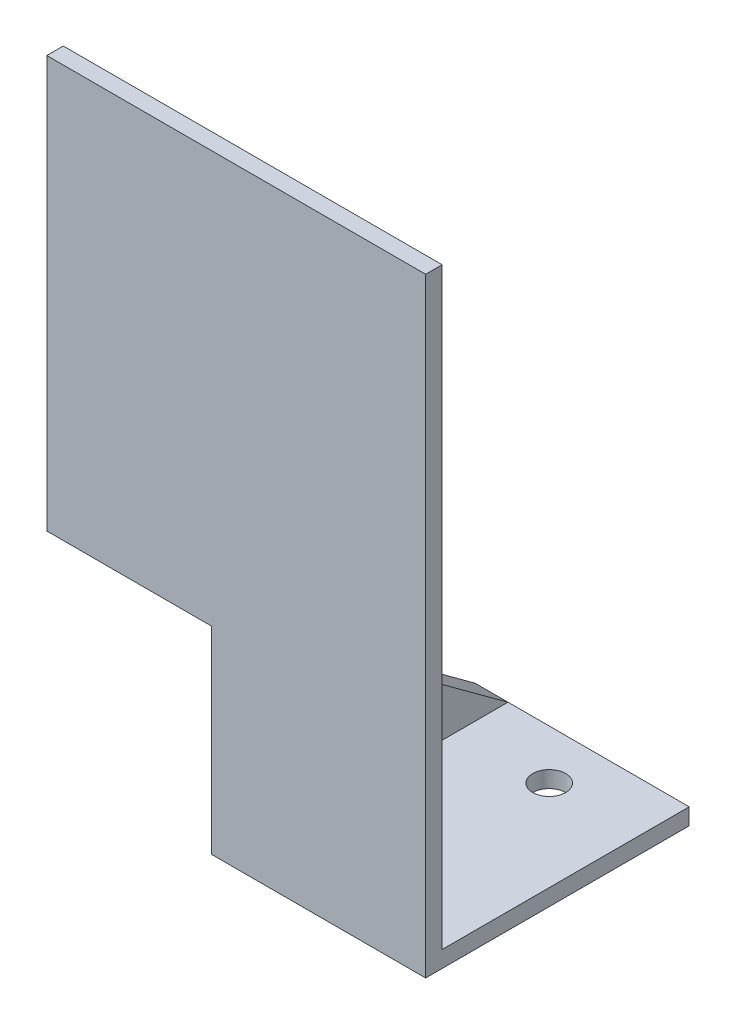
ISO-10303-21;
HEADER;
FILE_DESCRIPTION(('STEP AP214'),'2;1');
FILE_NAME('part.step','',(''),(''),'','','');
FILE_SCHEMA(('AUTOMOTIVE_DESIGN { 1 0 10303 214 1 1 1 1 }'));
ENDSEC;
DATA;
#1=APPLICATION_CONTEXT('core data for automotive mechanical design processes');
#2=APPLICATION_PROTOCOL_DEFINITION('international standard','automotive_design',2000,#1);
#3=PRODUCT_CONTEXT('',#1,'mechanical');
#4=PRODUCT('Part','Part','',(#3));
#5=PRODUCT_RELATED_PRODUCT_CATEGORY('part','',(#4));
#6=PRODUCT_DEFINITION_FORMATION('','',#4);
#7=PRODUCT_DEFINITION_CONTEXT('part definition',#1,'design');
#8=PRODUCT_DEFINITION('design','',#6,#7);
#9=PRODUCT_DEFINITION_SHAPE('','',#8);
#10=(LENGTH_UNIT() NAMED_UNIT(*) SI_UNIT(.MILLI.,.METRE.));
#11=(NAMED_UNIT(*) PLANE_ANGLE_UNIT() SI_UNIT($,.RADIAN.));
#12=(NAMED_UNIT(*) SI_UNIT($,.STERADIAN.) SOLID_ANGLE_UNIT());
#13=UNCERTAINTY_MEASURE_WITH_UNIT(LENGTH_MEASURE(1.E-05),#10,'distance_accuracy_value','');
#14=(GEOMETRIC_REPRESENTATION_CONTEXT(3) GLOBAL_UNCERTAINTY_ASSIGNED_CONTEXT((#13)) GLOBAL_UNIT_ASSIGNED_CONTEXT((#10,
#11,#12)) REPRESENTATION_CONTEXT('',''));
#15=CARTESIAN_POINT('',(0.,0.,0.));
#16=DIRECTION('',(0.,0.,1.));
#17=DIRECTION('',(1.,0.,0.));
#18=AXIS2_PLACEMENT_3D('',#15,#16,#17);
#19=CARTESIAN_POINT('',(146.05,6.35,0.));
#20=DIRECTION('',(0.,-1.,0.));
#21=DIRECTION('',(0.,0.,-1.));
#22=AXIS2_PLACEMENT_3D('',#19,#20,#21);
#23=PLANE('',#22);
#24=CARTESIAN_POINT('',(111.125,6.35,19.05));
#25=DIRECTION('',(0.,1.,0.));
#26=DIRECTION('',(0.,0.,1.));
#27=AXIS2_PLACEMENT_3D('',#24,#25,#26);
#28=CIRCLE('',#27,6.35);
#29=CARTESIAN_POINT('',(111.125,6.35,25.4));
#30=VERTEX_POINT('',#29);
#31=EDGE_CURVE('E218',#30,#30,#28,.T.);
#32=ORIENTED_EDGE('',*,*,#31,.F.);
#33=EDGE_LOOP('',(#32));
#34=FACE_BOUND('',#33,.T.);
#35=CARTESIAN_POINT('',(111.125,6.34999999999999,82.55));
#36=DIRECTION('',(0.,1.,0.));
#37=DIRECTION('',(0.,0.,1.));
#38=AXIS2_PLACEMENT_3D('',#35,#36,#37);
#39=CIRCLE('',#38,6.34999999999999);
#40=CARTESIAN_POINT('',(111.125,6.34999999999999,88.9));
#41=VERTEX_POINT('',#40);
#42=EDGE_CURVE('E223',#41,#41,#39,.T.);
#43=ORIENTED_EDGE('',*,*,#42,.F.);
#44=EDGE_LOOP('',(#43));
#45=FACE_BOUND('',#44,.T.);
#46=DIRECTION('',(0.,0.,1.));
#47=VECTOR('',#46,1.);
#48=CARTESIAN_POINT('',(76.2,6.35,0.));
#49=LINE('',#48,#47);
#50=CARTESIAN_POINT('',(76.2,6.35,0.));
#51=VERTEX_POINT('',#50);
#52=CARTESIAN_POINT('',(76.2,6.34999999999999,95.25));
#53=VERTEX_POINT('',#52);
#54=EDGE_CURVE('E145',#51,#53,#49,.T.);
#55=ORIENTED_EDGE('',*,*,#54,.T.);
#56=DIRECTION('',(-1.,0.,0.));
#57=VECTOR('',#56,1.);
#58=CARTESIAN_POINT('',(146.05,6.34999999999999,95.25));
#59=LINE('',#58,#57);
#60=CARTESIAN_POINT('',(146.05,6.34999999999999,95.25));
#61=VERTEX_POINT('',#60);
#62=EDGE_CURVE('E212',#61,#53,#59,.T.);
#63=ORIENTED_EDGE('',*,*,#62,.F.);
#64=DIRECTION('',(0.,0.,1.));
#65=VECTOR('',#64,1.);
#66=CARTESIAN_POINT('',(146.05,6.35,0.));
#67=LINE('',#66,#65);
#68=CARTESIAN_POINT('',(146.05,6.35,0.));
#69=VERTEX_POINT('',#68);
#70=EDGE_CURVE('E171',#69,#61,#67,.T.);
#71=ORIENTED_EDGE('',*,*,#70,.F.);
#72=DIRECTION('',(-1.,0.,0.));
#73=VECTOR('',#72,1.);
#74=CARTESIAN_POINT('',(146.05,6.35,0.));
#75=LINE('',#74,#73);
#76=EDGE_CURVE('E49',#69,#51,#75,.T.);
#77=ORIENTED_EDGE('',*,*,#76,.T.);
#78=EDGE_LOOP('',(#55,#63,#71,#77));
#79=FACE_BOUND('',#78,.T.);
#80=ADVANCED_FACE('F39',(#34,#45,#79),#23,.F.);
#81=CARTESIAN_POINT('',(146.05,0.,0.));
#82=DIRECTION('',(0.,0.,1.));
#83=DIRECTION('',(1.,0.,0.));
#84=AXIS2_PLACEMENT_3D('',#81,#82,#83);
#85=PLANE('',#84);
#86=DIRECTION('',(-1.,0.,0.));
#87=VECTOR('',#86,1.);
#88=CARTESIAN_POINT('',(146.05,0.,0.));
#89=LINE('',#88,#87);
#90=CARTESIAN_POINT('',(146.05,0.,0.));
#91=VERTEX_POINT('',#90);
#92=CARTESIAN_POINT('',(63.5,0.,0.));
#93=VERTEX_POINT('',#92);
#94=EDGE_CURVE('E187',#91,#93,#89,.T.);
#95=ORIENTED_EDGE('',*,*,#94,.T.);
#96=DIRECTION('',(0.,1.,0.));
#97=VECTOR('',#96,1.);
#98=CARTESIAN_POINT('',(63.5,0.,0.));
#99=LINE('',#98,#97);
#100=CARTESIAN_POINT('',(63.5,6.35,0.));
#101=VERTEX_POINT('',#100);
#102=EDGE_CURVE('E133',#93,#101,#99,.T.);
#103=ORIENTED_EDGE('',*,*,#102,.T.);
#104=DIRECTION('',(-1.,0.,0.));
#105=VECTOR('',#104,1.);
#106=CARTESIAN_POINT('',(76.2,6.35,0.));
#107=LINE('',#106,#105);
#108=EDGE_CURVE('E57',#51,#101,#107,.T.);
#109=ORIENTED_EDGE('',*,*,#108,.F.);
#110=ORIENTED_EDGE('',*,*,#76,.F.);
#111=DIRECTION('',(0.,1.,0.));
#112=VECTOR('',#111,1.);
#113=CARTESIAN_POINT('',(146.05,0.,0.));
#114=LINE('',#113,#112);
#115=EDGE_CURVE('E167',#91,#69,#114,.T.);
#116=ORIENTED_EDGE('',*,*,#115,.F.);
#117=EDGE_LOOP('',(#95,#103,#109,#110,#116));
#118=FACE_BOUND('',#117,.T.);
#119=ADVANCED_FACE('F41',(#118),#85,.F.);
#120=CARTESIAN_POINT('',(146.05,6.34999999999999,95.25));
#121=DIRECTION('',(0.,0.,1.));
#122=DIRECTION('',(1.,0.,0.));
#123=AXIS2_PLACEMENT_3D('',#120,#121,#122);
#124=PLANE('',#123);
#125=DIRECTION('',(0.,1.,0.));
#126=VECTOR('',#125,1.);
#127=CARTESIAN_POINT('',(76.2,6.34999999999999,95.25));
#128=LINE('',#127,#126);
#129=CARTESIAN_POINT('',(76.2,76.2,95.25));
#130=VERTEX_POINT('',#129);
#131=EDGE_CURVE('E65',#53,#130,#128,.T.);
#132=ORIENTED_EDGE('',*,*,#131,.T.);
#133=DIRECTION('',(-1.,0.,0.));
#134=VECTOR('',#133,1.);
#135=CARTESIAN_POINT('',(76.2,76.2,95.25));
#136=LINE('',#135,#134);
#137=CARTESIAN_POINT('',(63.5,76.2,95.25));
#138=VERTEX_POINT('',#137);
#139=EDGE_CURVE('E135',#130,#138,#136,.T.);
#140=ORIENTED_EDGE('',*,*,#139,.T.);
#141=DIRECTION('',(-1.,0.,0.));
#142=VECTOR('',#141,1.);
#143=CARTESIAN_POINT('',(146.05,76.2,95.25));
#144=LINE('',#143,#142);
#145=CARTESIAN_POINT('',(0.,76.2,95.25));
#146=VERTEX_POINT('',#145);
#147=EDGE_CURVE('E126',#138,#146,#144,.T.);
#148=ORIENTED_EDGE('',*,*,#147,.T.);
#149=DIRECTION('',(0.,1.,0.));
#150=VECTOR('',#149,1.);
#151=CARTESIAN_POINT('',(0.,6.34999999999999,95.25));
#152=LINE('',#151,#150);
#153=CARTESIAN_POINT('',(0.,234.95,95.25));
#154=VERTEX_POINT('',#153);
#155=EDGE_CURVE('E166',#146,#154,#152,.T.);
#156=ORIENTED_EDGE('',*,*,#155,.T.);
#157=DIRECTION('',(-1.,0.,0.));
#158=VECTOR('',#157,1.);
#159=CARTESIAN_POINT('',(146.05,234.95,95.25));
#160=LINE('',#159,#158);
#161=CARTESIAN_POINT('',(146.05,234.95,95.25));
#162=VERTEX_POINT('',#161);
#163=EDGE_CURVE('E208',#162,#154,#160,.T.);
#164=ORIENTED_EDGE('',*,*,#163,.F.);
#165=DIRECTION('',(0.,1.,0.));
#166=VECTOR('',#165,1.);
#167=CARTESIAN_POINT('',(146.05,6.34999999999999,95.25));
#168=LINE('',#167,#166);
#169=EDGE_CURVE('E175',#61,#162,#168,.T.);
#170=ORIENTED_EDGE('',*,*,#169,.F.);
#171=ORIENTED_EDGE('',*,*,#62,.T.);
#172=EDGE_LOOP('',(#132,#140,#148,#156,#164,#170,#171));
#173=FACE_BOUND('',#172,.T.);
#174=ADVANCED_FACE('F136',(#173),#124,.F.);
#175=CARTESIAN_POINT('',(146.05,234.95,101.6));
#176=DIRECTION('',(0.,-1.,0.));
#177=DIRECTION('',(0.,0.,-1.));
#178=AXIS2_PLACEMENT_3D('',#175,#176,#177);
#179=PLANE('',#178);
#180=DIRECTION('',(0.,0.,1.));
#181=VECTOR('',#180,1.);
#182=CARTESIAN_POINT('',(0.,234.95,101.6));
#183=LINE('',#182,#181);
#184=CARTESIAN_POINT('',(0.,234.95,101.6));
#185=VERTEX_POINT('',#184);
#186=EDGE_CURVE('E190',#154,#185,#183,.T.);
#187=ORIENTED_EDGE('',*,*,#186,.T.);
#188=DIRECTION('',(-1.,0.,0.));
#189=VECTOR('',#188,1.);
#190=CARTESIAN_POINT('',(146.05,234.95,101.6));
#191=LINE('',#190,#189);
#192=CARTESIAN_POINT('',(146.05,234.95,101.6));
#193=VERTEX_POINT('',#192);
#194=EDGE_CURVE('E204',#193,#185,#191,.T.);
#195=ORIENTED_EDGE('',*,*,#194,.F.);
#196=DIRECTION('',(0.,0.,1.));
#197=VECTOR('',#196,1.);
#198=CARTESIAN_POINT('',(146.05,234.95,101.6));
#199=LINE('',#198,#197);
#200=EDGE_CURVE('E178',#162,#193,#199,.T.);
#201=ORIENTED_EDGE('',*,*,#200,.F.);
#202=ORIENTED_EDGE('',*,*,#163,.T.);
#203=EDGE_LOOP('',(#187,#195,#201,#202));
#204=FACE_BOUND('',#203,.T.);
#205=ADVANCED_FACE('F251',(#204),#179,.F.);
#206=CARTESIAN_POINT('',(146.05,0.,101.6));
#207=DIRECTION('',(0.,0.,-1.));
#208=DIRECTION('',(-1.,0.,0.));
#209=AXIS2_PLACEMENT_3D('',#206,#207,#208);
#210=PLANE('',#209);
#211=DIRECTION('',(0.,-1.,0.));
#212=VECTOR('',#211,1.);
#213=CARTESIAN_POINT('',(0.,0.,101.6));
#214=LINE('',#213,#212);
#215=CARTESIAN_POINT('',(0.,76.2,101.6));
#216=VERTEX_POINT('',#215);
#217=EDGE_CURVE('E172',#185,#216,#214,.T.);
#218=ORIENTED_EDGE('',*,*,#217,.T.);
#219=DIRECTION('',(-1.,0.,0.));
#220=VECTOR('',#219,1.);
#221=CARTESIAN_POINT('',(0.,76.2,101.6));
#222=LINE('',#221,#220);
#223=CARTESIAN_POINT('',(63.5,76.2,101.6));
#224=VERTEX_POINT('',#223);
#225=EDGE_CURVE('E159',#224,#216,#222,.T.);
#226=ORIENTED_EDGE('',*,*,#225,.F.);
#227=DIRECTION('',(0.,1.,0.));
#228=VECTOR('',#227,1.);
#229=CARTESIAN_POINT('',(63.5,0.,101.6));
#230=LINE('',#229,#228);
#231=CARTESIAN_POINT('',(63.5,0.,101.6));
#232=VERTEX_POINT('',#231);
#233=EDGE_CURVE('E122',#232,#224,#230,.T.);
#234=ORIENTED_EDGE('',*,*,#233,.F.);
#235=DIRECTION('',(-1.,0.,0.));
#236=VECTOR('',#235,1.);
#237=CARTESIAN_POINT('',(146.05,0.,101.6));
#238=LINE('',#237,#236);
#239=CARTESIAN_POINT('',(146.05,0.,101.6));
#240=VERTEX_POINT('',#239);
#241=EDGE_CURVE('E200',#240,#232,#238,.T.);
#242=ORIENTED_EDGE('',*,*,#241,.F.);
#243=DIRECTION('',(0.,-1.,0.));
#244=VECTOR('',#243,1.);
#245=CARTESIAN_POINT('',(146.05,6.34999999999999,101.6));
#246=LINE('',#245,#244);
#247=EDGE_CURVE('E181',#193,#240,#246,.T.);
#248=ORIENTED_EDGE('',*,*,#247,.F.);
#249=ORIENTED_EDGE('',*,*,#194,.T.);
#250=EDGE_LOOP('',(#218,#226,#234,#242,#248,#249));
#251=FACE_BOUND('',#250,.T.);
#252=ADVANCED_FACE('F260',(#251),#210,.F.);
#253=CARTESIAN_POINT('',(146.05,0.,0.));
#254=DIRECTION('',(0.,1.,0.));
#255=DIRECTION('',(0.,0.,1.));
#256=AXIS2_PLACEMENT_3D('',#253,#254,#255);
#257=PLANE('',#256);
#258=CARTESIAN_POINT('',(111.125,0.,19.05));
#259=DIRECTION('',(0.,1.,0.));
#260=DIRECTION('',(0.,0.,1.));
#261=AXIS2_PLACEMENT_3D('',#258,#259,#260);
#262=CIRCLE('',#261,6.35);
#263=CARTESIAN_POINT('',(111.125,0.,25.4));
#264=VERTEX_POINT('',#263);
#265=EDGE_CURVE('E43',#264,#264,#262,.T.);
#266=ORIENTED_EDGE('',*,*,#265,.T.);
#267=EDGE_LOOP('',(#266));
#268=FACE_BOUND('',#267,.T.);
#269=CARTESIAN_POINT('',(111.125,0.,82.55));
#270=DIRECTION('',(0.,1.,0.));
#271=DIRECTION('',(0.,0.,1.));
#272=AXIS2_PLACEMENT_3D('',#269,#270,#271);
#273=CIRCLE('',#272,6.34999999999999);
#274=CARTESIAN_POINT('',(111.125,0.,88.9));
#275=VERTEX_POINT('',#274);
#276=EDGE_CURVE('E151',#275,#275,#273,.T.);
#277=ORIENTED_EDGE('',*,*,#276,.T.);
#278=EDGE_LOOP('',(#277));
#279=FACE_BOUND('',#278,.T.);
#280=ORIENTED_EDGE('',*,*,#241,.T.);
#281=DIRECTION('',(0.,0.,1.));
#282=VECTOR('',#281,1.);
#283=CARTESIAN_POINT('',(63.5,0.,-44.45));
#284=LINE('',#283,#282);
#285=EDGE_CURVE('E127',#93,#232,#284,.T.);
#286=ORIENTED_EDGE('',*,*,#285,.F.);
#287=ORIENTED_EDGE('',*,*,#94,.F.);
#288=DIRECTION('',(0.,0.,-1.));
#289=VECTOR('',#288,1.);
#290=CARTESIAN_POINT('',(146.05,0.,0.));
#291=LINE('',#290,#289);
#292=EDGE_CURVE('E184',#240,#91,#291,.T.);
#293=ORIENTED_EDGE('',*,*,#292,.F.);
#294=EDGE_LOOP('',(#280,#286,#287,#293));
#295=FACE_BOUND('',#294,.T.);
#296=ADVANCED_FACE('F264',(#268,#279,#295),#257,.F.);
#297=CARTESIAN_POINT('',(146.05,0.,0.));
#298=DIRECTION('',(1.,0.,0.));
#299=DIRECTION('',(0.,0.,-1.));
#300=AXIS2_PLACEMENT_3D('',#297,#298,#299);
#301=PLANE('',#300);
#302=ORIENTED_EDGE('',*,*,#115,.T.);
#303=ORIENTED_EDGE('',*,*,#70,.T.);
#304=ORIENTED_EDGE('',*,*,#169,.T.);
#305=ORIENTED_EDGE('',*,*,#200,.T.);
#306=ORIENTED_EDGE('',*,*,#247,.T.);
#307=ORIENTED_EDGE('',*,*,#292,.T.);
#308=EDGE_LOOP('',(#302,#303,#304,#305,#306,#307));
#309=FACE_BOUND('',#308,.T.);
#310=ADVANCED_FACE('F241',(#309),#301,.T.);
#311=CARTESIAN_POINT('',(0.,0.,0.));
#312=DIRECTION('',(1.,0.,0.));
#313=DIRECTION('',(0.,0.,-1.));
#314=AXIS2_PLACEMENT_3D('',#311,#312,#313);
#315=PLANE('',#314);
#316=ORIENTED_EDGE('',*,*,#155,.F.);
#317=DIRECTION('',(0.,0.,1.));
#318=VECTOR('',#317,1.);
#319=CARTESIAN_POINT('',(0.,76.2,0.));
#320=LINE('',#319,#318);
#321=EDGE_CURVE('E11',#146,#216,#320,.T.);
#322=ORIENTED_EDGE('',*,*,#321,.T.);
#323=ORIENTED_EDGE('',*,*,#217,.F.);
#324=ORIENTED_EDGE('',*,*,#186,.F.);
#325=EDGE_LOOP('',(#316,#322,#323,#324));
#326=FACE_BOUND('',#325,.T.);
#327=ADVANCED_FACE('F269',(#326),#315,.F.);
#328=CARTESIAN_POINT('',(63.5,0.,-44.45));
#329=DIRECTION('',(1.,0.,0.));
#330=DIRECTION('',(0.,0.,-1.));
#331=AXIS2_PLACEMENT_3D('',#328,#329,#330);
#332=PLANE('',#331);
#333=ORIENTED_EDGE('',*,*,#285,.T.);
#334=ORIENTED_EDGE('',*,*,#233,.T.);
#335=DIRECTION('',(0.,0.,1.));
#336=VECTOR('',#335,1.);
#337=CARTESIAN_POINT('',(63.5,76.2,-44.45));
#338=LINE('',#337,#336);
#339=EDGE_CURVE('E116',#138,#224,#338,.T.);
#340=ORIENTED_EDGE('',*,*,#339,.F.);
#341=DIRECTION('',(0.,-0.591363663627517,-0.806404995855706));
#342=VECTOR('',#341,1.);
#343=CARTESIAN_POINT('',(63.5,6.35,0.));
#344=LINE('',#343,#342);
#345=EDGE_CURVE('E120',#138,#101,#344,.T.);
#346=ORIENTED_EDGE('',*,*,#345,.T.);
#347=ORIENTED_EDGE('',*,*,#102,.F.);
#348=EDGE_LOOP('',(#333,#334,#340,#346,#347));
#349=FACE_BOUND('',#348,.T.);
#350=ADVANCED_FACE('F118',(#349),#332,.F.);
#351=CARTESIAN_POINT('',(0.,76.2,-44.45));
#352=DIRECTION('',(0.,1.,0.));
#353=DIRECTION('',(0.,0.,1.));
#354=AXIS2_PLACEMENT_3D('',#351,#352,#353);
#355=PLANE('',#354);
#356=ORIENTED_EDGE('',*,*,#339,.T.);
#357=ORIENTED_EDGE('',*,*,#225,.T.);
#358=ORIENTED_EDGE('',*,*,#321,.F.);
#359=ORIENTED_EDGE('',*,*,#147,.F.);
#360=EDGE_LOOP('',(#356,#357,#358,#359));
#361=FACE_BOUND('',#360,.T.);
#362=ADVANCED_FACE('F130',(#361),#355,.F.);
#363=CARTESIAN_POINT('',(76.2,6.35,0.));
#364=DIRECTION('',(0.,0.806404995855705,-0.591363663627517));
#365=DIRECTION('',(0.,0.591363663627517,0.806404995855706));
#366=AXIS2_PLACEMENT_3D('',#363,#364,#365);
#367=PLANE('',#366);
#368=ORIENTED_EDGE('',*,*,#345,.F.);
#369=ORIENTED_EDGE('',*,*,#139,.F.);
#370=DIRECTION('',(0.,-0.591363663627517,-0.806404995855706));
#371=VECTOR('',#370,1.);
#372=CARTESIAN_POINT('',(76.2,6.35,0.));
#373=LINE('',#372,#371);
#374=EDGE_CURVE('E141',#130,#51,#373,.T.);
#375=ORIENTED_EDGE('',*,*,#374,.T.);
#376=ORIENTED_EDGE('',*,*,#108,.T.);
#377=EDGE_LOOP('',(#368,#369,#375,#376));
#378=FACE_BOUND('',#377,.T.);
#379=ADVANCED_FACE('F143',(#378),#367,.T.);
#380=CARTESIAN_POINT('',(76.2,0.,0.));
#381=DIRECTION('',(-1.,0.,0.));
#382=DIRECTION('',(0.,0.,1.));
#383=AXIS2_PLACEMENT_3D('',#380,#381,#382);
#384=PLANE('',#383);
#385=ORIENTED_EDGE('',*,*,#54,.F.);
#386=ORIENTED_EDGE('',*,*,#374,.F.);
#387=ORIENTED_EDGE('',*,*,#131,.F.);
#388=EDGE_LOOP('',(#385,#386,#387));
#389=FACE_BOUND('',#388,.T.);
#390=ADVANCED_FACE('F234',(#389),#384,.F.);
#391=CARTESIAN_POINT('',(111.125,-6.35000000000001,82.55));
#392=DIRECTION('',(0.,1.,0.));
#393=DIRECTION('',(0.,0.,1.));
#394=AXIS2_PLACEMENT_3D('',#391,#392,#393);
#395=CYLINDRICAL_SURFACE('',#394,6.34999999999999);
#396=ORIENTED_EDGE('',*,*,#42,.T.);
#397=EDGE_LOOP('',(#396));
#398=FACE_BOUND('',#397,.T.);
#399=ORIENTED_EDGE('',*,*,#276,.F.);
#400=EDGE_LOOP('',(#399));
#401=FACE_BOUND('',#400,.T.);
#402=ADVANCED_FACE('F283',(#398,#401),#395,.F.);
#403=CARTESIAN_POINT('',(111.125,-6.35,19.05));
#404=DIRECTION('',(0.,1.,0.));
#405=DIRECTION('',(0.,0.,1.));
#406=AXIS2_PLACEMENT_3D('',#403,#404,#405);
#407=CYLINDRICAL_SURFACE('',#406,6.35);
#408=ORIENTED_EDGE('',*,*,#31,.T.);
#409=EDGE_LOOP('',(#408));
#410=FACE_BOUND('',#409,.T.);
#411=ORIENTED_EDGE('',*,*,#265,.F.);
#412=EDGE_LOOP('',(#411));
#413=FACE_BOUND('',#412,.T.);
#414=ADVANCED_FACE('F286',(#410,#413),#407,.F.);
#415=CLOSED_SHELL('',(#80,#119,#174,#205,#252,#296,#310,#327,#350,#362,#379,#390,#402,#414));
#416=MANIFOLD_SOLID_BREP('B2',#415);
#417=ADVANCED_BREP_SHAPE_REPRESENTATION('',(#18,#416),#14);
#418=SHAPE_DEFINITION_REPRESENTATION(#9,#417);
ENDSEC;
END-ISO-10303-21;
